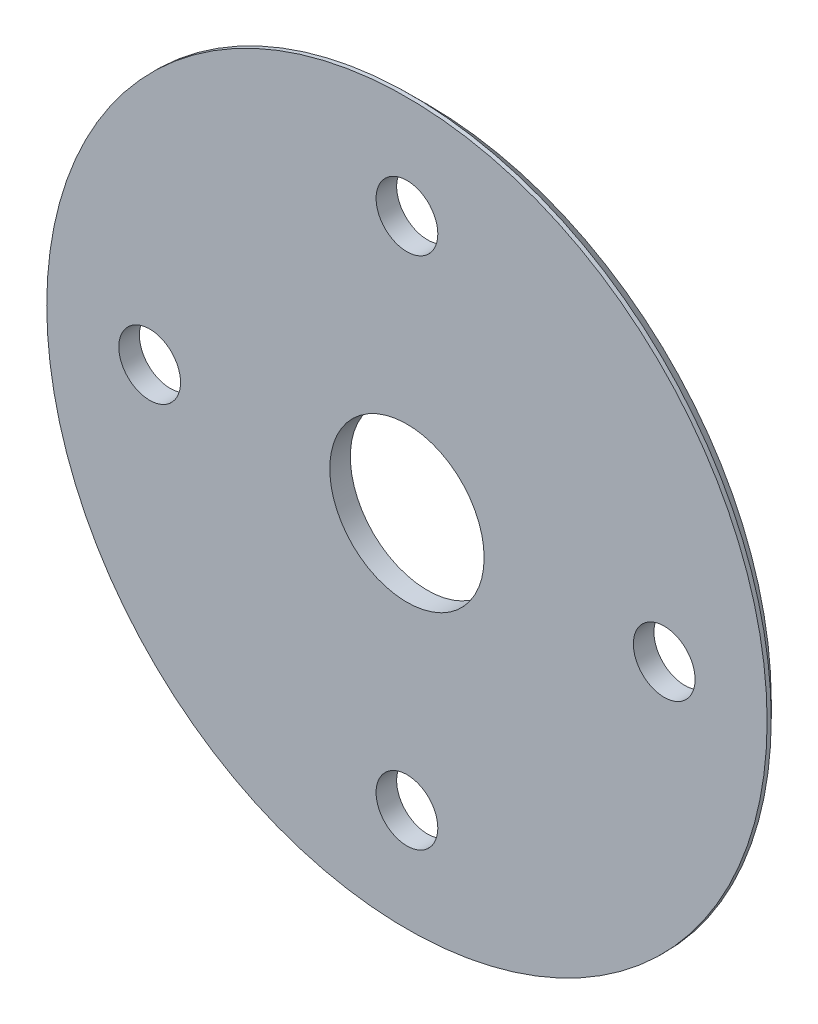
ISO-10303-21;
HEADER;
FILE_DESCRIPTION(('STEP AP214'),'2;1');
FILE_NAME('part.step','',(''),(''),'','','');
FILE_SCHEMA(('AUTOMOTIVE_DESIGN { 1 0 10303 214 1 1 1 1 }'));
ENDSEC;
DATA;
#1=APPLICATION_CONTEXT('core data for automotive mechanical design processes');
#2=APPLICATION_PROTOCOL_DEFINITION('international standard','automotive_design',2000,#1);
#3=PRODUCT_CONTEXT('',#1,'mechanical');
#4=PRODUCT('Part','Part','',(#3));
#5=PRODUCT_RELATED_PRODUCT_CATEGORY('part','',(#4));
#6=PRODUCT_DEFINITION_FORMATION('','',#4);
#7=PRODUCT_DEFINITION_CONTEXT('part definition',#1,'design');
#8=PRODUCT_DEFINITION('design','',#6,#7);
#9=PRODUCT_DEFINITION_SHAPE('','',#8);
#10=(LENGTH_UNIT() NAMED_UNIT(*) SI_UNIT(.MILLI.,.METRE.));
#11=(NAMED_UNIT(*) PLANE_ANGLE_UNIT() SI_UNIT($,.RADIAN.));
#12=(NAMED_UNIT(*) SI_UNIT($,.STERADIAN.) SOLID_ANGLE_UNIT());
#13=UNCERTAINTY_MEASURE_WITH_UNIT(LENGTH_MEASURE(1.E-05),#10,'distance_accuracy_value','');
#14=(GEOMETRIC_REPRESENTATION_CONTEXT(3) GLOBAL_UNCERTAINTY_ASSIGNED_CONTEXT((#13)) GLOBAL_UNIT_ASSIGNED_CONTEXT((#10,
#11,#12)) REPRESENTATION_CONTEXT('',''));
#15=CARTESIAN_POINT('',(0.,0.,0.));
#16=DIRECTION('',(0.,0.,1.));
#17=DIRECTION('',(1.,0.,0.));
#18=AXIS2_PLACEMENT_3D('',#15,#16,#17);
#19=CARTESIAN_POINT('',(0.,0.,2.));
#20=DIRECTION('',(0.,0.,1.));
#21=DIRECTION('',(1.,0.,0.));
#22=AXIS2_PLACEMENT_3D('',#19,#20,#21);
#23=PLANE('',#22);
#24=CARTESIAN_POINT('',(-25.,1.74574066942157E-13,2.));
#25=DIRECTION('',(0.,0.,1.));
#26=DIRECTION('',(1.,0.,0.));
#27=AXIS2_PLACEMENT_3D('',#24,#25,#26);
#28=CIRCLE('',#27,3.);
#29=CARTESIAN_POINT('',(-22.,1.74574066942157E-13,2.));
#30=VERTEX_POINT('',#29);
#31=EDGE_CURVE('E91',#30,#30,#28,.T.);
#32=ORIENTED_EDGE('',*,*,#31,.F.);
#33=EDGE_LOOP('',(#32));
#34=FACE_BOUND('',#33,.T.);
#35=CARTESIAN_POINT('',(25.,0.,2.));
#36=DIRECTION('',(0.,0.,1.));
#37=DIRECTION('',(1.,0.,0.));
#38=AXIS2_PLACEMENT_3D('',#35,#36,#37);
#39=CIRCLE('',#38,3.);
#40=CARTESIAN_POINT('',(28.,0.,2.));
#41=VERTEX_POINT('',#40);
#42=EDGE_CURVE('E75',#41,#41,#39,.T.);
#43=ORIENTED_EDGE('',*,*,#42,.F.);
#44=EDGE_LOOP('',(#43));
#45=FACE_BOUND('',#44,.T.);
#46=CARTESIAN_POINT('',(0.,0.,2.));
#47=DIRECTION('',(0.,0.,1.));
#48=DIRECTION('',(1.,0.,0.));
#49=AXIS2_PLACEMENT_3D('',#46,#47,#48);
#50=CIRCLE('',#49,35.);
#51=CARTESIAN_POINT('',(35.,0.,2.));
#52=VERTEX_POINT('',#51);
#53=EDGE_CURVE('E61',#52,#52,#50,.T.);
#54=ORIENTED_EDGE('',*,*,#53,.T.);
#55=EDGE_LOOP('',(#54));
#56=FACE_BOUND('',#55,.T.);
#57=CARTESIAN_POINT('',(0.,0.,2.));
#58=DIRECTION('',(0.,0.,1.));
#59=DIRECTION('',(1.,0.,0.));
#60=AXIS2_PLACEMENT_3D('',#57,#58,#59);
#61=CIRCLE('',#60,7.5);
#62=CARTESIAN_POINT('',(7.5,0.,2.));
#63=VERTEX_POINT('',#62);
#64=EDGE_CURVE('E68',#63,#63,#61,.T.);
#65=ORIENTED_EDGE('',*,*,#64,.F.);
#66=EDGE_LOOP('',(#65));
#67=FACE_BOUND('',#66,.T.);
#68=CARTESIAN_POINT('',(0.,-25.,2.));
#69=DIRECTION('',(0.,0.,1.));
#70=DIRECTION('',(1.,0.,0.));
#71=AXIS2_PLACEMENT_3D('',#68,#69,#70);
#72=CIRCLE('',#71,3.);
#73=CARTESIAN_POINT('',(2.99999999999991,-25.,2.));
#74=VERTEX_POINT('',#73);
#75=EDGE_CURVE('E83',#74,#74,#72,.T.);
#76=ORIENTED_EDGE('',*,*,#75,.F.);
#77=EDGE_LOOP('',(#76));
#78=FACE_BOUND('',#77,.T.);
#79=CARTESIAN_POINT('',(2.61861100413235E-13,25.,2.));
#80=DIRECTION('',(0.,0.,1.));
#81=DIRECTION('',(1.,0.,0.));
#82=AXIS2_PLACEMENT_3D('',#79,#80,#81);
#83=CIRCLE('',#82,3.);
#84=CARTESIAN_POINT('',(3.00000000000026,25.,2.));
#85=VERTEX_POINT('',#84);
#86=EDGE_CURVE('E99',#85,#85,#83,.T.);
#87=ORIENTED_EDGE('',*,*,#86,.F.);
#88=EDGE_LOOP('',(#87));
#89=FACE_BOUND('',#88,.T.);
#90=ADVANCED_FACE('F45',(#34,#45,#56,#67,#78,#89),#23,.T.);
#91=CARTESIAN_POINT('',(0.,0.,0.));
#92=DIRECTION('',(0.,0.,1.));
#93=DIRECTION('',(1.,0.,0.));
#94=AXIS2_PLACEMENT_3D('',#91,#92,#93);
#95=PLANE('',#94);
#96=CARTESIAN_POINT('',(0.,0.,0.));
#97=DIRECTION('',(0.,0.,1.));
#98=DIRECTION('',(1.,0.,0.));
#99=AXIS2_PLACEMENT_3D('',#96,#97,#98);
#100=CIRCLE('',#99,33.4);
#101=CARTESIAN_POINT('',(33.4,0.,0.));
#102=VERTEX_POINT('',#101);
#103=EDGE_CURVE('E10',#102,#102,#100,.F.);
#104=ORIENTED_EDGE('',*,*,#103,.T.);
#105=EDGE_LOOP('',(#104));
#106=FACE_BOUND('',#105,.T.);
#107=CARTESIAN_POINT('',(0.,0.,0.));
#108=DIRECTION('',(0.,0.,1.));
#109=DIRECTION('',(1.,0.,0.));
#110=AXIS2_PLACEMENT_3D('',#107,#108,#109);
#111=CIRCLE('',#110,7.5);
#112=CARTESIAN_POINT('',(7.5,0.,0.));
#113=VERTEX_POINT('',#112);
#114=EDGE_CURVE('E71',#113,#113,#111,.T.);
#115=ORIENTED_EDGE('',*,*,#114,.T.);
#116=EDGE_LOOP('',(#115));
#117=FACE_BOUND('',#116,.T.);
#118=CARTESIAN_POINT('',(25.,0.,0.));
#119=DIRECTION('',(0.,0.,1.));
#120=DIRECTION('',(1.,0.,0.));
#121=AXIS2_PLACEMENT_3D('',#118,#119,#120);
#122=CIRCLE('',#121,3.);
#123=CARTESIAN_POINT('',(28.,0.,0.));
#124=VERTEX_POINT('',#123);
#125=EDGE_CURVE('E79',#124,#124,#122,.T.);
#126=ORIENTED_EDGE('',*,*,#125,.T.);
#127=EDGE_LOOP('',(#126));
#128=FACE_BOUND('',#127,.T.);
#129=CARTESIAN_POINT('',(0.,-25.,0.));
#130=DIRECTION('',(0.,0.,1.));
#131=DIRECTION('',(1.,0.,0.));
#132=AXIS2_PLACEMENT_3D('',#129,#130,#131);
#133=CIRCLE('',#132,3.);
#134=CARTESIAN_POINT('',(2.99999999999991,-25.,0.));
#135=VERTEX_POINT('',#134);
#136=EDGE_CURVE('E87',#135,#135,#133,.T.);
#137=ORIENTED_EDGE('',*,*,#136,.T.);
#138=EDGE_LOOP('',(#137));
#139=FACE_BOUND('',#138,.T.);
#140=CARTESIAN_POINT('',(-25.,1.74574066942157E-13,0.));
#141=DIRECTION('',(0.,0.,1.));
#142=DIRECTION('',(1.,0.,0.));
#143=AXIS2_PLACEMENT_3D('',#140,#141,#142);
#144=CIRCLE('',#143,3.);
#145=CARTESIAN_POINT('',(-22.,1.74574066942157E-13,0.));
#146=VERTEX_POINT('',#145);
#147=EDGE_CURVE('E95',#146,#146,#144,.T.);
#148=ORIENTED_EDGE('',*,*,#147,.T.);
#149=EDGE_LOOP('',(#148));
#150=FACE_BOUND('',#149,.T.);
#151=CARTESIAN_POINT('',(2.61861100413235E-13,25.,0.));
#152=DIRECTION('',(0.,0.,1.));
#153=DIRECTION('',(1.,0.,0.));
#154=AXIS2_PLACEMENT_3D('',#151,#152,#153);
#155=CIRCLE('',#154,3.);
#156=CARTESIAN_POINT('',(3.00000000000026,25.,0.));
#157=VERTEX_POINT('',#156);
#158=EDGE_CURVE('E103',#157,#157,#155,.T.);
#159=ORIENTED_EDGE('',*,*,#158,.T.);
#160=EDGE_LOOP('',(#159));
#161=FACE_BOUND('',#160,.T.);
#162=ADVANCED_FACE('F117',(#106,#117,#128,#139,#150,#161),#95,.F.);
#163=CARTESIAN_POINT('',(0.,0.,2.));
#164=DIRECTION('',(0.,0.,-1.));
#165=DIRECTION('',(-1.,0.,0.));
#166=AXIS2_PLACEMENT_3D('',#163,#164,#165);
#167=CYLINDRICAL_SURFACE('',#166,35.);
#168=CARTESIAN_POINT('',(0.,0.,1.59999999999999));
#169=DIRECTION('',(0.,0.,1.));
#170=DIRECTION('',(1.,0.,0.));
#171=AXIS2_PLACEMENT_3D('',#168,#169,#170);
#172=CIRCLE('',#171,35.);
#173=CARTESIAN_POINT('',(35.,0.,1.59999999999999));
#174=VERTEX_POINT('',#173);
#175=EDGE_CURVE('E54',#174,#174,#172,.T.);
#176=ORIENTED_EDGE('',*,*,#175,.T.);
#177=EDGE_LOOP('',(#176));
#178=FACE_BOUND('',#177,.T.);
#179=ORIENTED_EDGE('',*,*,#53,.F.);
#180=EDGE_LOOP('',(#179));
#181=FACE_BOUND('',#180,.T.);
#182=ADVANCED_FACE('F123',(#178,#181),#167,.T.);
#183=CARTESIAN_POINT('',(0.,0.,2.));
#184=DIRECTION('',(0.,0.,-1.));
#185=DIRECTION('',(-1.,0.,0.));
#186=AXIS2_PLACEMENT_3D('',#183,#184,#185);
#187=CYLINDRICAL_SURFACE('',#186,7.5);
#188=ORIENTED_EDGE('',*,*,#64,.T.);
#189=EDGE_LOOP('',(#188));
#190=FACE_BOUND('',#189,.T.);
#191=ORIENTED_EDGE('',*,*,#114,.F.);
#192=EDGE_LOOP('',(#191));
#193=FACE_BOUND('',#192,.T.);
#194=ADVANCED_FACE('F128',(#190,#193),#187,.F.);
#195=CARTESIAN_POINT('',(25.,0.,2.));
#196=DIRECTION('',(0.,0.,-1.));
#197=DIRECTION('',(-1.,0.,0.));
#198=AXIS2_PLACEMENT_3D('',#195,#196,#197);
#199=CYLINDRICAL_SURFACE('',#198,3.);
#200=ORIENTED_EDGE('',*,*,#42,.T.);
#201=EDGE_LOOP('',(#200));
#202=FACE_BOUND('',#201,.T.);
#203=ORIENTED_EDGE('',*,*,#125,.F.);
#204=EDGE_LOOP('',(#203));
#205=FACE_BOUND('',#204,.T.);
#206=ADVANCED_FACE('F134',(#202,#205),#199,.F.);
#207=CARTESIAN_POINT('',(0.,-25.,2.));
#208=DIRECTION('',(0.,0.,-1.));
#209=DIRECTION('',(-1.,0.,0.));
#210=AXIS2_PLACEMENT_3D('',#207,#208,#209);
#211=CYLINDRICAL_SURFACE('',#210,3.);
#212=ORIENTED_EDGE('',*,*,#75,.T.);
#213=EDGE_LOOP('',(#212));
#214=FACE_BOUND('',#213,.T.);
#215=ORIENTED_EDGE('',*,*,#136,.F.);
#216=EDGE_LOOP('',(#215));
#217=FACE_BOUND('',#216,.T.);
#218=ADVANCED_FACE('F144',(#214,#217),#211,.F.);
#219=CARTESIAN_POINT('',(-25.,1.74574066942157E-13,2.));
#220=DIRECTION('',(0.,0.,-1.));
#221=DIRECTION('',(-1.,0.,0.));
#222=AXIS2_PLACEMENT_3D('',#219,#220,#221);
#223=CYLINDRICAL_SURFACE('',#222,3.);
#224=ORIENTED_EDGE('',*,*,#31,.T.);
#225=EDGE_LOOP('',(#224));
#226=FACE_BOUND('',#225,.T.);
#227=ORIENTED_EDGE('',*,*,#147,.F.);
#228=EDGE_LOOP('',(#227));
#229=FACE_BOUND('',#228,.T.);
#230=ADVANCED_FACE('F147',(#226,#229),#223,.F.);
#231=CARTESIAN_POINT('',(2.61861100413235E-13,25.,2.));
#232=DIRECTION('',(0.,0.,-1.));
#233=DIRECTION('',(-1.,0.,0.));
#234=AXIS2_PLACEMENT_3D('',#231,#232,#233);
#235=CYLINDRICAL_SURFACE('',#234,3.);
#236=ORIENTED_EDGE('',*,*,#86,.T.);
#237=EDGE_LOOP('',(#236));
#238=FACE_BOUND('',#237,.T.);
#239=ORIENTED_EDGE('',*,*,#158,.F.);
#240=EDGE_LOOP('',(#239));
#241=FACE_BOUND('',#240,.T.);
#242=ADVANCED_FACE('F113',(#238,#241),#235,.F.);
#243=CARTESIAN_POINT('',(0.,0.,1.59999999999999));
#244=DIRECTION('',(0.,0.,1.));
#245=DIRECTION('',(1.,0.,0.));
#246=AXIS2_PLACEMENT_3D('',#243,#244,#245);
#247=CONICAL_SURFACE('',#246,35.,0.785398163397455);
#248=ORIENTED_EDGE('',*,*,#103,.F.);
#249=EDGE_LOOP('',(#248));
#250=FACE_BOUND('',#249,.T.);
#251=ORIENTED_EDGE('',*,*,#175,.F.);
#252=EDGE_LOOP('',(#251));
#253=FACE_BOUND('',#252,.T.);
#254=ADVANCED_FACE('F48',(#250,#253),#247,.T.);
#255=CLOSED_SHELL('',(#90,#162,#182,#194,#206,#218,#230,#242,#254));
#256=MANIFOLD_SOLID_BREP('B2',#255);
#257=ADVANCED_BREP_SHAPE_REPRESENTATION('',(#18,#256),#14);
#258=SHAPE_DEFINITION_REPRESENTATION(#9,#257);
ENDSEC;
END-ISO-10303-21;
